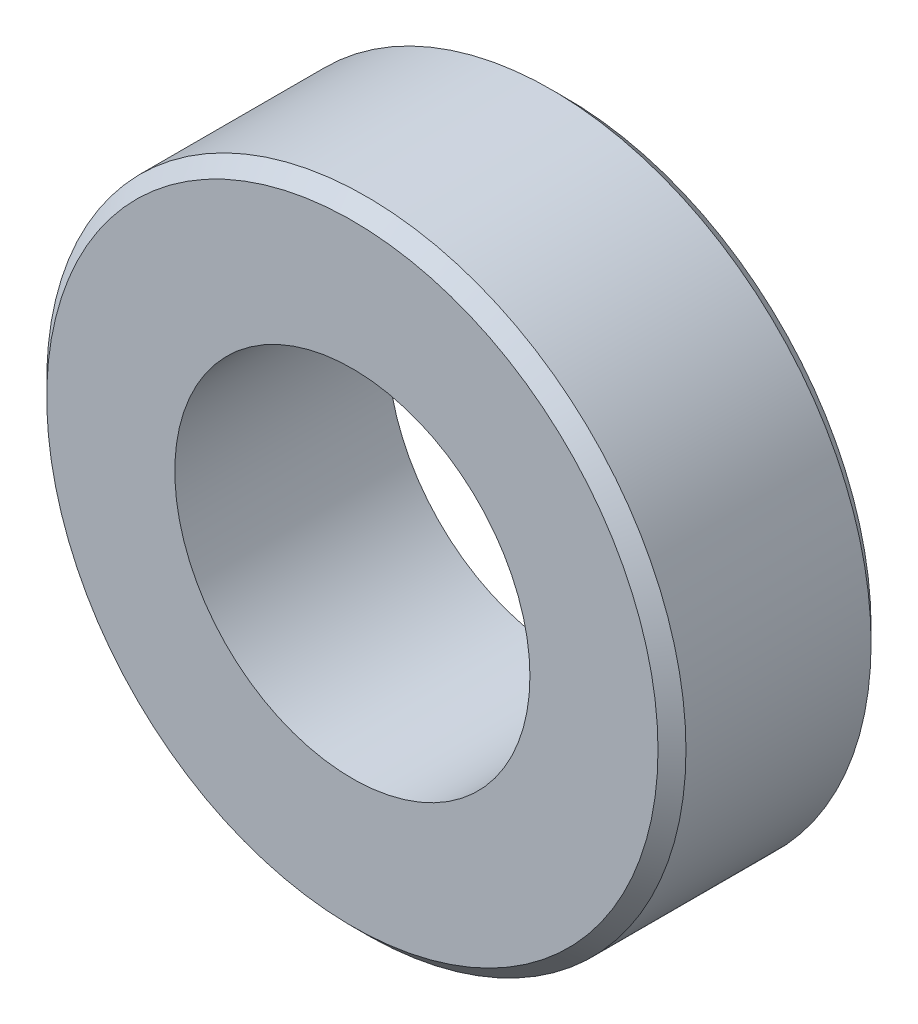
ISO-10303-21;
HEADER;
FILE_DESCRIPTION(('STEP AP214'),'2;1');
FILE_NAME('part.step','',(''),(''),'','','');
FILE_SCHEMA(('AUTOMOTIVE_DESIGN { 1 0 10303 214 1 1 1 1 }'));
ENDSEC;
DATA;
#1=APPLICATION_CONTEXT('core data for automotive mechanical design processes');
#2=APPLICATION_PROTOCOL_DEFINITION('international standard','automotive_design',2000,#1);
#3=PRODUCT_CONTEXT('',#1,'mechanical');
#4=PRODUCT('Part','Part','',(#3));
#5=PRODUCT_RELATED_PRODUCT_CATEGORY('part','',(#4));
#6=PRODUCT_DEFINITION_FORMATION('','',#4);
#7=PRODUCT_DEFINITION_CONTEXT('part definition',#1,'design');
#8=PRODUCT_DEFINITION('design','',#6,#7);
#9=PRODUCT_DEFINITION_SHAPE('','',#8);
#10=(LENGTH_UNIT() NAMED_UNIT(*) SI_UNIT(.MILLI.,.METRE.));
#11=(NAMED_UNIT(*) PLANE_ANGLE_UNIT() SI_UNIT($,.RADIAN.));
#12=(NAMED_UNIT(*) SI_UNIT($,.STERADIAN.) SOLID_ANGLE_UNIT());
#13=UNCERTAINTY_MEASURE_WITH_UNIT(LENGTH_MEASURE(1.E-05),#10,'distance_accuracy_value','');
#14=(GEOMETRIC_REPRESENTATION_CONTEXT(3) GLOBAL_UNCERTAINTY_ASSIGNED_CONTEXT((#13)) GLOBAL_UNIT_ASSIGNED_CONTEXT((#10,
#11,#12)) REPRESENTATION_CONTEXT('',''));
#15=CARTESIAN_POINT('',(0.,0.,0.));
#16=DIRECTION('',(0.,0.,1.));
#17=DIRECTION('',(1.,0.,0.));
#18=AXIS2_PLACEMENT_3D('',#15,#16,#17);
#19=CARTESIAN_POINT('',(0.,0.,7.62));
#20=DIRECTION('',(0.,0.,1.));
#21=DIRECTION('',(1.,0.,0.));
#22=AXIS2_PLACEMENT_3D('',#19,#20,#21);
#23=PLANE('',#22);
#24=CARTESIAN_POINT('',(0.,0.,7.62));
#25=DIRECTION('',(0.,0.,1.));
#26=DIRECTION('',(1.,0.,0.));
#27=AXIS2_PLACEMENT_3D('',#24,#25,#26);
#28=CIRCLE('',#27,10.93);
#29=CARTESIAN_POINT('',(10.93,0.,7.62));
#30=VERTEX_POINT('',#29);
#31=EDGE_CURVE('E10',#30,#30,#28,.T.);
#32=ORIENTED_EDGE('',*,*,#31,.T.);
#33=EDGE_LOOP('',(#32));
#34=FACE_BOUND('',#33,.T.);
#35=CARTESIAN_POINT('',(0.,0.,7.62));
#36=DIRECTION('',(0.,0.,1.));
#37=DIRECTION('',(1.,0.,0.));
#38=AXIS2_PLACEMENT_3D('',#35,#36,#37);
#39=CIRCLE('',#38,6.35);
#40=CARTESIAN_POINT('',(6.35,0.,7.62));
#41=VERTEX_POINT('',#40);
#42=EDGE_CURVE('E68',#41,#41,#39,.T.);
#43=ORIENTED_EDGE('',*,*,#42,.F.);
#44=EDGE_LOOP('',(#43));
#45=FACE_BOUND('',#44,.T.);
#46=ADVANCED_FACE('F43',(#34,#45),#23,.T.);
#47=CARTESIAN_POINT('',(0.,0.,0.));
#48=DIRECTION('',(0.,0.,1.));
#49=DIRECTION('',(1.,0.,0.));
#50=AXIS2_PLACEMENT_3D('',#47,#48,#49);
#51=PLANE('',#50);
#52=CARTESIAN_POINT('',(0.,0.,0.));
#53=DIRECTION('',(0.,0.,1.));
#54=DIRECTION('',(1.,0.,0.));
#55=AXIS2_PLACEMENT_3D('',#52,#53,#54);
#56=CIRCLE('',#55,10.93);
#57=CARTESIAN_POINT('',(10.93,0.,0.));
#58=VERTEX_POINT('',#57);
#59=EDGE_CURVE('E52',#58,#58,#56,.F.);
#60=ORIENTED_EDGE('',*,*,#59,.T.);
#61=EDGE_LOOP('',(#60));
#62=FACE_BOUND('',#61,.T.);
#63=CARTESIAN_POINT('',(0.,0.,0.));
#64=DIRECTION('',(0.,0.,1.));
#65=DIRECTION('',(1.,0.,0.));
#66=AXIS2_PLACEMENT_3D('',#63,#64,#65);
#67=CIRCLE('',#66,6.35);
#68=CARTESIAN_POINT('',(6.35,0.,0.));
#69=VERTEX_POINT('',#68);
#70=EDGE_CURVE('E69',#69,#69,#67,.T.);
#71=ORIENTED_EDGE('',*,*,#70,.T.);
#72=EDGE_LOOP('',(#71));
#73=FACE_BOUND('',#72,.T.);
#74=ADVANCED_FACE('F81',(#62,#73),#51,.F.);
#75=CARTESIAN_POINT('',(0.,0.,7.62));
#76=DIRECTION('',(0.,0.,-1.));
#77=DIRECTION('',(-1.,0.,0.));
#78=AXIS2_PLACEMENT_3D('',#75,#76,#77);
#79=CYLINDRICAL_SURFACE('',#78,11.43);
#80=CARTESIAN_POINT('',(0.,0.,0.500000000000002));
#81=DIRECTION('',(0.,0.,1.));
#82=DIRECTION('',(1.,0.,0.));
#83=AXIS2_PLACEMENT_3D('',#80,#81,#82);
#84=CIRCLE('',#83,11.43);
#85=CARTESIAN_POINT('',(11.43,0.,0.500000000000002));
#86=VERTEX_POINT('',#85);
#87=EDGE_CURVE('E57',#86,#86,#84,.T.);
#88=ORIENTED_EDGE('',*,*,#87,.T.);
#89=EDGE_LOOP('',(#88));
#90=FACE_BOUND('',#89,.T.);
#91=CARTESIAN_POINT('',(0.,0.,7.12));
#92=DIRECTION('',(0.,0.,1.));
#93=DIRECTION('',(1.,0.,0.));
#94=AXIS2_PLACEMENT_3D('',#91,#92,#93);
#95=CIRCLE('',#94,11.43);
#96=CARTESIAN_POINT('',(11.43,0.,7.12));
#97=VERTEX_POINT('',#96);
#98=EDGE_CURVE('E62',#97,#97,#95,.F.);
#99=ORIENTED_EDGE('',*,*,#98,.T.);
#100=EDGE_LOOP('',(#99));
#101=FACE_BOUND('',#100,.T.);
#102=ADVANCED_FACE('F86',(#90,#101),#79,.T.);
#103=CARTESIAN_POINT('',(0.,0.,7.62));
#104=DIRECTION('',(0.,0.,-1.));
#105=DIRECTION('',(-1.,0.,0.));
#106=AXIS2_PLACEMENT_3D('',#103,#104,#105);
#107=CYLINDRICAL_SURFACE('',#106,6.35);
#108=ORIENTED_EDGE('',*,*,#42,.T.);
#109=EDGE_LOOP('',(#108));
#110=FACE_BOUND('',#109,.T.);
#111=ORIENTED_EDGE('',*,*,#70,.F.);
#112=EDGE_LOOP('',(#111));
#113=FACE_BOUND('',#112,.T.);
#114=ADVANCED_FACE('F77',(#110,#113),#107,.F.);
#115=CARTESIAN_POINT('',(0.,0.,0.500000000000002));
#116=DIRECTION('',(0.,0.,1.));
#117=DIRECTION('',(1.,0.,0.));
#118=AXIS2_PLACEMENT_3D('',#115,#116,#117);
#119=CONICAL_SURFACE('',#118,11.43,0.78539816339745);
#120=ORIENTED_EDGE('',*,*,#59,.F.);
#121=EDGE_LOOP('',(#120));
#122=FACE_BOUND('',#121,.T.);
#123=ORIENTED_EDGE('',*,*,#87,.F.);
#124=EDGE_LOOP('',(#123));
#125=FACE_BOUND('',#124,.T.);
#126=ADVANCED_FACE('F93',(#122,#125),#119,.T.);
#127=CARTESIAN_POINT('',(0.,0.,7.62));
#128=DIRECTION('',(0.,0.,-1.));
#129=DIRECTION('',(-1.,0.,0.));
#130=AXIS2_PLACEMENT_3D('',#127,#128,#129);
#131=CONICAL_SURFACE('',#130,10.93,0.785398163397445);
#132=ORIENTED_EDGE('',*,*,#98,.F.);
#133=EDGE_LOOP('',(#132));
#134=FACE_BOUND('',#133,.T.);
#135=ORIENTED_EDGE('',*,*,#31,.F.);
#136=EDGE_LOOP('',(#135));
#137=FACE_BOUND('',#136,.T.);
#138=ADVANCED_FACE('F46',(#134,#137),#131,.T.);
#139=CLOSED_SHELL('',(#46,#74,#102,#114,#126,#138));
#140=MANIFOLD_SOLID_BREP('B2',#139);
#141=ADVANCED_BREP_SHAPE_REPRESENTATION('',(#18,#140),#14);
#142=SHAPE_DEFINITION_REPRESENTATION(#9,#141);
ENDSEC;
END-ISO-10303-21;
